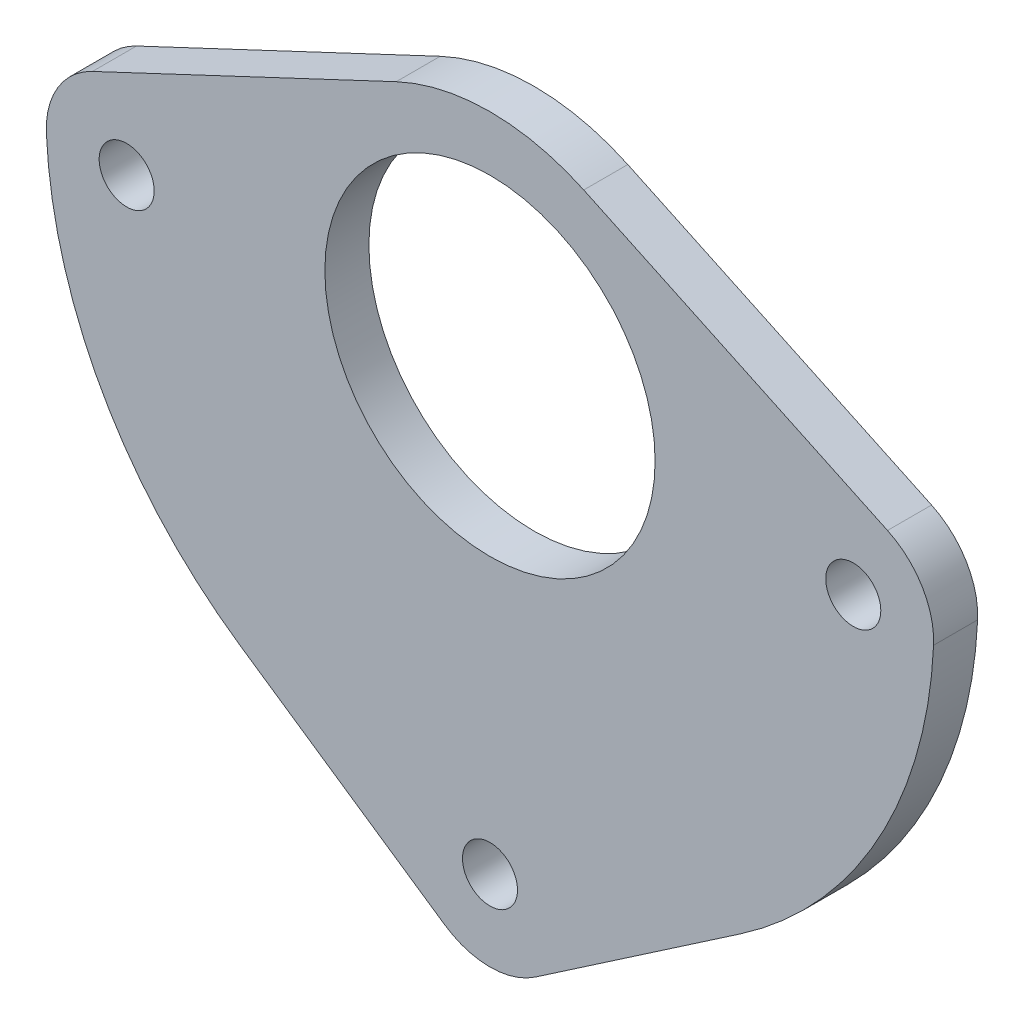
ISO-10303-21;
HEADER;
FILE_DESCRIPTION(('STEP AP214'),'2;1');
FILE_NAME('part.step','',(''),(''),'','','');
FILE_SCHEMA(('AUTOMOTIVE_DESIGN { 1 0 10303 214 1 1 1 1 }'));
ENDSEC;
DATA;
#1=APPLICATION_CONTEXT('core data for automotive mechanical design processes');
#2=APPLICATION_PROTOCOL_DEFINITION('international standard','automotive_design',2000,#1);
#3=PRODUCT_CONTEXT('',#1,'mechanical');
#4=PRODUCT('Part','Part','',(#3));
#5=PRODUCT_RELATED_PRODUCT_CATEGORY('part','',(#4));
#6=PRODUCT_DEFINITION_FORMATION('','',#4);
#7=PRODUCT_DEFINITION_CONTEXT('part definition',#1,'design');
#8=PRODUCT_DEFINITION('design','',#6,#7);
#9=PRODUCT_DEFINITION_SHAPE('','',#8);
#10=(LENGTH_UNIT() NAMED_UNIT(*) SI_UNIT(.MILLI.,.METRE.));
#11=(NAMED_UNIT(*) PLANE_ANGLE_UNIT() SI_UNIT($,.RADIAN.));
#12=(NAMED_UNIT(*) SI_UNIT($,.STERADIAN.) SOLID_ANGLE_UNIT());
#13=UNCERTAINTY_MEASURE_WITH_UNIT(LENGTH_MEASURE(1.E-05),#10,'distance_accuracy_value','');
#14=(GEOMETRIC_REPRESENTATION_CONTEXT(3) GLOBAL_UNCERTAINTY_ASSIGNED_CONTEXT((#13)) GLOBAL_UNIT_ASSIGNED_CONTEXT((#10,
#11,#12)) REPRESENTATION_CONTEXT('',''));
#15=CARTESIAN_POINT('',(0.,0.,0.));
#16=DIRECTION('',(0.,0.,1.));
#17=DIRECTION('',(1.,0.,0.));
#18=AXIS2_PLACEMENT_3D('',#15,#16,#17);
#19=CARTESIAN_POINT('',(137.79852098193,-51.7025,2.));
#20=DIRECTION('',(0.,0.,-1.));
#21=DIRECTION('',(-1.,0.,0.));
#22=AXIS2_PLACEMENT_3D('',#19,#20,#21);
#23=PLANE('',#22);
#24=CARTESIAN_POINT('',(137.79852098193,-51.7025,2.));
#25=DIRECTION('',(0.,0.,1.));
#26=DIRECTION('',(-1.,0.,0.));
#27=AXIS2_PLACEMENT_3D('',#24,#25,#26);
#28=CIRCLE('',#27,7.30249999999997);
#29=CARTESIAN_POINT('',(145.093488746815,-52.0340894438584,2.));
#30=VERTEX_POINT('',#29);
#31=CARTESIAN_POINT('',(140.908646061078,-45.0954107587341,2.));
#32=VERTEX_POINT('',#31);
#33=EDGE_CURVE('E161',#30,#32,#28,.T.);
#34=ORIENTED_EDGE('',*,*,#33,.T.);
#35=DIRECTION('',(-0.904770864945693,0.425898675679349,0.));
#36=VECTOR('',#35,1.);
#37=CARTESIAN_POINT('',(113.316494495517,-32.1070827010862,2.));
#38=LINE('',#37,#36);
#39=CARTESIAN_POINT('',(113.316494495517,-32.1070827010862,2.));
#40=VERTEX_POINT('',#39);
#41=EDGE_CURVE('E99',#32,#40,#38,.T.);
#42=ORIENTED_EDGE('',*,*,#41,.T.);
#43=CARTESIAN_POINT('',(104.79852098193,-50.2025,2.));
#44=DIRECTION('',(0.,0.,1.));
#45=DIRECTION('',(-1.,0.,0.));
#46=AXIS2_PLACEMENT_3D('',#43,#44,#45);
#47=CIRCLE('',#46,20.);
#48=CARTESIAN_POINT('',(96.2805474683429,-32.1070827010862,2.));
#49=VERTEX_POINT('',#48);
#50=EDGE_CURVE('E182',#40,#49,#47,.T.);
#51=ORIENTED_EDGE('',*,*,#50,.T.);
#52=DIRECTION('',(-0.904770864945693,-0.425898675679349,0.));
#53=VECTOR('',#52,1.);
#54=CARTESIAN_POINT('',(96.2805474683429,-32.1070827010862,2.));
#55=LINE('',#54,#53);
#56=CARTESIAN_POINT('',(68.6883959027814,-45.0954107587341,2.));
#57=VERTEX_POINT('',#56);
#58=EDGE_CURVE('E201',#49,#57,#55,.T.);
#59=ORIENTED_EDGE('',*,*,#58,.T.);
#60=CARTESIAN_POINT('',(71.7985209819299,-51.7025,2.));
#61=DIRECTION('',(0.,0.,1.));
#62=DIRECTION('',(1.,0.,0.));
#63=AXIS2_PLACEMENT_3D('',#60,#61,#62);
#64=CIRCLE('',#63,7.30249999999993);
#65=CARTESIAN_POINT('',(64.5035532170442,-52.0340894438585,2.));
#66=VERTEX_POINT('',#65);
#67=EDGE_CURVE('E198',#57,#66,#64,.T.);
#68=ORIENTED_EDGE('',*,*,#67,.T.);
#69=CARTESIAN_POINT('',(104.79852098193,-50.2025,2.));
#70=DIRECTION('',(0.,0.,1.));
#71=DIRECTION('',(1.,0.,0.));
#72=AXIS2_PLACEMENT_3D('',#69,#70,#71);
#73=CIRCLE('',#72,40.3365733183177);
#74=CARTESIAN_POINT('',(82.0652922016273,-83.5227559456924,2.));
#75=VERTEX_POINT('',#74);
#76=EDGE_CURVE('E200',#66,#75,#73,.T.);
#77=ORIENTED_EDGE('',*,*,#76,.T.);
#78=DIRECTION('',(0.826055691016293,-0.563588498232172,0.));
#79=VECTOR('',#78,1.);
#80=CARTESIAN_POINT('',(100.682915973589,-96.224900288264,2.));
#81=LINE('',#80,#79);
#82=CARTESIAN_POINT('',(100.682915973589,-96.224900288264,2.));
#83=VERTEX_POINT('',#82);
#84=EDGE_CURVE('E124',#75,#83,#81,.T.);
#85=ORIENTED_EDGE('',*,*,#84,.T.);
#86=CARTESIAN_POINT('',(104.79852098193,-90.1926286046177,2.));
#87=DIRECTION('',(0.,0.,1.));
#88=DIRECTION('',(1.,0.,0.));
#89=AXIS2_PLACEMENT_3D('',#86,#87,#88);
#90=CIRCLE('',#89,7.3024999999999);
#91=CARTESIAN_POINT('',(108.91412599027,-96.224900288264,2.));
#92=VERTEX_POINT('',#91);
#93=EDGE_CURVE('E118',#83,#92,#90,.T.);
#94=ORIENTED_EDGE('',*,*,#93,.T.);
#95=DIRECTION('',(0.826055691016293,0.563588498232172,0.));
#96=VECTOR('',#95,1.);
#97=CARTESIAN_POINT('',(108.91412599027,-96.224900288264,2.));
#98=LINE('',#97,#96);
#99=CARTESIAN_POINT('',(127.531749762232,-83.5227559456924,2.));
#100=VERTEX_POINT('',#99);
#101=EDGE_CURVE('E122',#92,#100,#98,.T.);
#102=ORIENTED_EDGE('',*,*,#101,.T.);
#103=CARTESIAN_POINT('',(104.79852098193,-50.2025,2.));
#104=DIRECTION('',(0.,0.,1.));
#105=DIRECTION('',(-1.,0.,0.));
#106=AXIS2_PLACEMENT_3D('',#103,#104,#105);
#107=CIRCLE('',#106,40.3365733183177);
#108=EDGE_CURVE('E50',#100,#30,#107,.T.);
#109=ORIENTED_EDGE('',*,*,#108,.T.);
#110=EDGE_LOOP('',(#34,#42,#51,#59,#68,#77,#85,#94,#102,#109));
#111=FACE_BOUND('',#110,.T.);
#112=CARTESIAN_POINT('',(71.7985209819299,-51.7025,2.));
#113=DIRECTION('',(0.,0.,1.));
#114=DIRECTION('',(1.,0.,0.));
#115=AXIS2_PLACEMENT_3D('',#112,#113,#114);
#116=CIRCLE('',#115,2.50000000000001);
#117=CARTESIAN_POINT('',(74.2985209819299,-51.7025,2.));
#118=VERTEX_POINT('',#117);
#119=EDGE_CURVE('E146',#118,#118,#116,.T.);
#120=ORIENTED_EDGE('',*,*,#119,.F.);
#121=EDGE_LOOP('',(#120));
#122=FACE_BOUND('',#121,.T.);
#123=CARTESIAN_POINT('',(104.79852098193,-90.1926286046176,2.));
#124=DIRECTION('',(0.,0.,1.));
#125=DIRECTION('',(1.,0.,0.));
#126=AXIS2_PLACEMENT_3D('',#123,#124,#125);
#127=CIRCLE('',#126,2.5);
#128=CARTESIAN_POINT('',(107.29852098193,-90.1926286046176,2.));
#129=VERTEX_POINT('',#128);
#130=EDGE_CURVE('E212',#129,#129,#127,.T.);
#131=ORIENTED_EDGE('',*,*,#130,.F.);
#132=EDGE_LOOP('',(#131));
#133=FACE_BOUND('',#132,.T.);
#134=CARTESIAN_POINT('',(137.79852098193,-51.7025,2.));
#135=DIRECTION('',(0.,0.,1.));
#136=DIRECTION('',(1.,0.,0.));
#137=AXIS2_PLACEMENT_3D('',#134,#135,#136);
#138=CIRCLE('',#137,2.5);
#139=CARTESIAN_POINT('',(140.29852098193,-51.7025,2.));
#140=VERTEX_POINT('',#139);
#141=EDGE_CURVE('E218',#140,#140,#138,.T.);
#142=ORIENTED_EDGE('',*,*,#141,.F.);
#143=EDGE_LOOP('',(#142));
#144=FACE_BOUND('',#143,.T.);
#145=CARTESIAN_POINT('',(104.79852098193,-50.2025,2.));
#146=DIRECTION('',(0.,0.,1.));
#147=DIRECTION('',(1.,0.,0.));
#148=AXIS2_PLACEMENT_3D('',#145,#146,#147);
#149=CIRCLE('',#148,15.);
#150=CARTESIAN_POINT('',(119.79852098193,-50.2025,2.));
#151=VERTEX_POINT('',#150);
#152=EDGE_CURVE('E224',#151,#151,#149,.T.);
#153=ORIENTED_EDGE('',*,*,#152,.F.);
#154=EDGE_LOOP('',(#153));
#155=FACE_BOUND('',#154,.T.);
#156=ADVANCED_FACE('F33',(#111,#122,#133,#144,#155),#23,.F.);
#157=CARTESIAN_POINT('',(137.79852098193,-51.7025,-2.));
#158=DIRECTION('',(0.,0.,-1.));
#159=DIRECTION('',(-1.,0.,0.));
#160=AXIS2_PLACEMENT_3D('',#157,#158,#159);
#161=PLANE('',#160);
#162=CARTESIAN_POINT('',(137.79852098193,-51.7025,-2.));
#163=DIRECTION('',(0.,0.,1.));
#164=DIRECTION('',(1.,0.,0.));
#165=AXIS2_PLACEMENT_3D('',#162,#163,#164);
#166=CIRCLE('',#165,2.5);
#167=CARTESIAN_POINT('',(140.29852098193,-51.7025,-2.));
#168=VERTEX_POINT('',#167);
#169=EDGE_CURVE('E221',#168,#168,#166,.T.);
#170=ORIENTED_EDGE('',*,*,#169,.T.);
#171=EDGE_LOOP('',(#170));
#172=FACE_BOUND('',#171,.T.);
#173=CARTESIAN_POINT('',(71.7985209819299,-51.7025,-2.));
#174=DIRECTION('',(0.,0.,1.));
#175=DIRECTION('',(1.,0.,0.));
#176=AXIS2_PLACEMENT_3D('',#173,#174,#175);
#177=CIRCLE('',#176,2.50000000000001);
#178=CARTESIAN_POINT('',(74.2985209819299,-51.7025,-2.));
#179=VERTEX_POINT('',#178);
#180=EDGE_CURVE('E209',#179,#179,#177,.T.);
#181=ORIENTED_EDGE('',*,*,#180,.T.);
#182=EDGE_LOOP('',(#181));
#183=FACE_BOUND('',#182,.T.);
#184=CARTESIAN_POINT('',(137.79852098193,-51.7025,-2.));
#185=DIRECTION('',(0.,0.,1.));
#186=DIRECTION('',(-1.,0.,0.));
#187=AXIS2_PLACEMENT_3D('',#184,#185,#186);
#188=CIRCLE('',#187,7.30249999999997);
#189=CARTESIAN_POINT('',(145.093488746815,-52.0340894438584,-2.));
#190=VERTEX_POINT('',#189);
#191=CARTESIAN_POINT('',(140.908646061078,-45.0954107587341,-2.));
#192=VERTEX_POINT('',#191);
#193=EDGE_CURVE('E142',#190,#192,#188,.T.);
#194=ORIENTED_EDGE('',*,*,#193,.F.);
#195=CARTESIAN_POINT('',(104.79852098193,-50.2025,-2.));
#196=DIRECTION('',(0.,0.,1.));
#197=DIRECTION('',(-1.,0.,0.));
#198=AXIS2_PLACEMENT_3D('',#195,#196,#197);
#199=CIRCLE('',#198,40.3365733183177);
#200=CARTESIAN_POINT('',(127.531749762232,-83.5227559456924,-2.));
#201=VERTEX_POINT('',#200);
#202=EDGE_CURVE('E91',#201,#190,#199,.T.);
#203=ORIENTED_EDGE('',*,*,#202,.F.);
#204=DIRECTION('',(0.826055691016293,0.563588498232172,0.));
#205=VECTOR('',#204,1.);
#206=CARTESIAN_POINT('',(108.91412599027,-96.224900288264,-2.));
#207=LINE('',#206,#205);
#208=CARTESIAN_POINT('',(108.91412599027,-96.224900288264,-2.));
#209=VERTEX_POINT('',#208);
#210=EDGE_CURVE('E85',#209,#201,#207,.T.);
#211=ORIENTED_EDGE('',*,*,#210,.F.);
#212=CARTESIAN_POINT('',(104.79852098193,-90.1926286046177,-2.));
#213=DIRECTION('',(0.,0.,1.));
#214=DIRECTION('',(1.,0.,0.));
#215=AXIS2_PLACEMENT_3D('',#212,#213,#214);
#216=CIRCLE('',#215,7.3024999999999);
#217=CARTESIAN_POINT('',(100.682915973589,-96.224900288264,-2.));
#218=VERTEX_POINT('',#217);
#219=EDGE_CURVE('E132',#218,#209,#216,.T.);
#220=ORIENTED_EDGE('',*,*,#219,.F.);
#221=DIRECTION('',(0.826055691016293,-0.563588498232172,0.));
#222=VECTOR('',#221,1.);
#223=CARTESIAN_POINT('',(100.682915973589,-96.224900288264,-2.));
#224=LINE('',#223,#222);
#225=CARTESIAN_POINT('',(82.0652922016273,-83.5227559456924,-2.));
#226=VERTEX_POINT('',#225);
#227=EDGE_CURVE('E156',#226,#218,#224,.T.);
#228=ORIENTED_EDGE('',*,*,#227,.F.);
#229=CARTESIAN_POINT('',(104.79852098193,-50.2025,-2.));
#230=DIRECTION('',(0.,0.,1.));
#231=DIRECTION('',(1.,0.,0.));
#232=AXIS2_PLACEMENT_3D('',#229,#230,#231);
#233=CIRCLE('',#232,40.3365733183177);
#234=CARTESIAN_POINT('',(64.5035532170442,-52.0340894438585,-2.));
#235=VERTEX_POINT('',#234);
#236=EDGE_CURVE('E154',#235,#226,#233,.T.);
#237=ORIENTED_EDGE('',*,*,#236,.F.);
#238=CARTESIAN_POINT('',(71.7985209819299,-51.7025,-2.));
#239=DIRECTION('',(0.,0.,1.));
#240=DIRECTION('',(1.,0.,0.));
#241=AXIS2_PLACEMENT_3D('',#238,#239,#240);
#242=CIRCLE('',#241,7.30249999999993);
#243=CARTESIAN_POINT('',(68.6883959027814,-45.0954107587341,-2.));
#244=VERTEX_POINT('',#243);
#245=EDGE_CURVE('E152',#244,#235,#242,.T.);
#246=ORIENTED_EDGE('',*,*,#245,.F.);
#247=DIRECTION('',(-0.904770864945693,-0.425898675679349,0.));
#248=VECTOR('',#247,1.);
#249=CARTESIAN_POINT('',(96.2805474683429,-32.1070827010862,-2.));
#250=LINE('',#249,#248);
#251=CARTESIAN_POINT('',(96.2805474683429,-32.1070827010862,-2.));
#252=VERTEX_POINT('',#251);
#253=EDGE_CURVE('E150',#252,#244,#250,.T.);
#254=ORIENTED_EDGE('',*,*,#253,.F.);
#255=CARTESIAN_POINT('',(104.79852098193,-50.2025,-2.));
#256=DIRECTION('',(0.,0.,1.));
#257=DIRECTION('',(-1.,0.,0.));
#258=AXIS2_PLACEMENT_3D('',#255,#256,#257);
#259=CIRCLE('',#258,20.);
#260=CARTESIAN_POINT('',(113.316494495517,-32.1070827010862,-2.));
#261=VERTEX_POINT('',#260);
#262=EDGE_CURVE('E148',#261,#252,#259,.T.);
#263=ORIENTED_EDGE('',*,*,#262,.F.);
#264=DIRECTION('',(-0.904770864945693,0.425898675679349,0.));
#265=VECTOR('',#264,1.);
#266=CARTESIAN_POINT('',(113.316494495517,-32.1070827010862,-2.));
#267=LINE('',#266,#265);
#268=EDGE_CURVE('E145',#192,#261,#267,.T.);
#269=ORIENTED_EDGE('',*,*,#268,.F.);
#270=EDGE_LOOP('',(#194,#203,#211,#220,#228,#237,#246,#254,#263,#269));
#271=FACE_BOUND('',#270,.T.);
#272=CARTESIAN_POINT('',(104.79852098193,-90.1926286046176,-2.));
#273=DIRECTION('',(0.,0.,1.));
#274=DIRECTION('',(1.,0.,0.));
#275=AXIS2_PLACEMENT_3D('',#272,#273,#274);
#276=CIRCLE('',#275,2.5);
#277=CARTESIAN_POINT('',(107.29852098193,-90.1926286046176,-2.));
#278=VERTEX_POINT('',#277);
#279=EDGE_CURVE('E215',#278,#278,#276,.T.);
#280=ORIENTED_EDGE('',*,*,#279,.T.);
#281=EDGE_LOOP('',(#280));
#282=FACE_BOUND('',#281,.T.);
#283=CARTESIAN_POINT('',(104.79852098193,-50.2025,-2.));
#284=DIRECTION('',(0.,0.,1.));
#285=DIRECTION('',(1.,0.,0.));
#286=AXIS2_PLACEMENT_3D('',#283,#284,#285);
#287=CIRCLE('',#286,15.);
#288=CARTESIAN_POINT('',(119.79852098193,-50.2025,-2.));
#289=VERTEX_POINT('',#288);
#290=EDGE_CURVE('E227',#289,#289,#287,.T.);
#291=ORIENTED_EDGE('',*,*,#290,.T.);
#292=EDGE_LOOP('',(#291));
#293=FACE_BOUND('',#292,.T.);
#294=ADVANCED_FACE('F186',(#172,#183,#271,#282,#293),#161,.T.);
#295=CARTESIAN_POINT('',(137.79852098193,-51.7025,2.));
#296=DIRECTION('',(0.,0.,-1.));
#297=DIRECTION('',(-1.,0.,0.));
#298=AXIS2_PLACEMENT_3D('',#295,#296,#297);
#299=CYLINDRICAL_SURFACE('',#298,7.30249999999997);
#300=ORIENTED_EDGE('',*,*,#193,.T.);
#301=DIRECTION('',(0.,0.,-1.));
#302=VECTOR('',#301,1.);
#303=CARTESIAN_POINT('',(140.908646061078,-45.0954107587341,2.));
#304=LINE('',#303,#302);
#305=EDGE_CURVE('E11',#32,#192,#304,.T.);
#306=ORIENTED_EDGE('',*,*,#305,.F.);
#307=ORIENTED_EDGE('',*,*,#33,.F.);
#308=DIRECTION('',(0.,0.,-1.));
#309=VECTOR('',#308,1.);
#310=CARTESIAN_POINT('',(145.093488746815,-52.0340894438584,2.));
#311=LINE('',#310,#309);
#312=EDGE_CURVE('E138',#30,#190,#311,.T.);
#313=ORIENTED_EDGE('',*,*,#312,.T.);
#314=EDGE_LOOP('',(#300,#306,#307,#313));
#315=FACE_BOUND('',#314,.T.);
#316=ADVANCED_FACE('F35',(#315),#299,.T.);
#317=CARTESIAN_POINT('',(113.316494495517,-32.1070827010862,2.));
#318=DIRECTION('',(-0.425898675679349,-0.904770864945693,0.));
#319=DIRECTION('',(0.904770864945693,-0.425898675679349,0.));
#320=AXIS2_PLACEMENT_3D('',#317,#318,#319);
#321=PLANE('',#320);
#322=ORIENTED_EDGE('',*,*,#268,.T.);
#323=DIRECTION('',(0.,0.,-1.));
#324=VECTOR('',#323,1.);
#325=CARTESIAN_POINT('',(113.316494495517,-32.1070827010862,2.));
#326=LINE('',#325,#324);
#327=EDGE_CURVE('E42',#40,#261,#326,.T.);
#328=ORIENTED_EDGE('',*,*,#327,.F.);
#329=ORIENTED_EDGE('',*,*,#41,.F.);
#330=ORIENTED_EDGE('',*,*,#305,.T.);
#331=EDGE_LOOP('',(#322,#328,#329,#330));
#332=FACE_BOUND('',#331,.T.);
#333=ADVANCED_FACE('F267',(#332),#321,.F.);
#334=CARTESIAN_POINT('',(104.79852098193,-50.2025,2.));
#335=DIRECTION('',(0.,0.,-1.));
#336=DIRECTION('',(-1.,0.,0.));
#337=AXIS2_PLACEMENT_3D('',#334,#335,#336);
#338=CYLINDRICAL_SURFACE('',#337,20.);
#339=ORIENTED_EDGE('',*,*,#262,.T.);
#340=DIRECTION('',(0.,0.,-1.));
#341=VECTOR('',#340,1.);
#342=CARTESIAN_POINT('',(96.2805474683429,-32.1070827010862,2.));
#343=LINE('',#342,#341);
#344=EDGE_CURVE('E174',#49,#252,#343,.T.);
#345=ORIENTED_EDGE('',*,*,#344,.F.);
#346=ORIENTED_EDGE('',*,*,#50,.F.);
#347=ORIENTED_EDGE('',*,*,#327,.T.);
#348=EDGE_LOOP('',(#339,#345,#346,#347));
#349=FACE_BOUND('',#348,.T.);
#350=ADVANCED_FACE('F180',(#349),#338,.T.);
#351=CARTESIAN_POINT('',(96.2805474683429,-32.1070827010862,2.));
#352=DIRECTION('',(0.425898675679349,-0.904770864945693,0.));
#353=DIRECTION('',(0.904770864945693,0.425898675679349,0.));
#354=AXIS2_PLACEMENT_3D('',#351,#352,#353);
#355=PLANE('',#354);
#356=ORIENTED_EDGE('',*,*,#253,.T.);
#357=DIRECTION('',(0.,0.,-1.));
#358=VECTOR('',#357,1.);
#359=CARTESIAN_POINT('',(68.6883959027814,-45.0954107587341,2.));
#360=LINE('',#359,#358);
#361=EDGE_CURVE('E171',#57,#244,#360,.T.);
#362=ORIENTED_EDGE('',*,*,#361,.F.);
#363=ORIENTED_EDGE('',*,*,#58,.F.);
#364=ORIENTED_EDGE('',*,*,#344,.T.);
#365=EDGE_LOOP('',(#356,#362,#363,#364));
#366=FACE_BOUND('',#365,.T.);
#367=ADVANCED_FACE('F192',(#366),#355,.F.);
#368=CARTESIAN_POINT('',(71.7985209819299,-51.7025,2.));
#369=DIRECTION('',(0.,0.,-1.));
#370=DIRECTION('',(-1.,0.,0.));
#371=AXIS2_PLACEMENT_3D('',#368,#369,#370);
#372=CYLINDRICAL_SURFACE('',#371,7.30249999999993);
#373=ORIENTED_EDGE('',*,*,#245,.T.);
#374=DIRECTION('',(0.,0.,-1.));
#375=VECTOR('',#374,1.);
#376=CARTESIAN_POINT('',(64.5035532170442,-52.0340894438585,2.));
#377=LINE('',#376,#375);
#378=EDGE_CURVE('E168',#66,#235,#377,.T.);
#379=ORIENTED_EDGE('',*,*,#378,.F.);
#380=ORIENTED_EDGE('',*,*,#67,.F.);
#381=ORIENTED_EDGE('',*,*,#361,.T.);
#382=EDGE_LOOP('',(#373,#379,#380,#381));
#383=FACE_BOUND('',#382,.T.);
#384=ADVANCED_FACE('F196',(#383),#372,.T.);
#385=CARTESIAN_POINT('',(104.79852098193,-50.2025,2.));
#386=DIRECTION('',(0.,0.,-1.));
#387=DIRECTION('',(-1.,0.,0.));
#388=AXIS2_PLACEMENT_3D('',#385,#386,#387);
#389=CYLINDRICAL_SURFACE('',#388,40.3365733183177);
#390=ORIENTED_EDGE('',*,*,#236,.T.);
#391=DIRECTION('',(0.,0.,-1.));
#392=VECTOR('',#391,1.);
#393=CARTESIAN_POINT('',(82.0652922016273,-83.5227559456924,2.));
#394=LINE('',#393,#392);
#395=EDGE_CURVE('E165',#75,#226,#394,.T.);
#396=ORIENTED_EDGE('',*,*,#395,.F.);
#397=ORIENTED_EDGE('',*,*,#76,.F.);
#398=ORIENTED_EDGE('',*,*,#378,.T.);
#399=EDGE_LOOP('',(#390,#396,#397,#398));
#400=FACE_BOUND('',#399,.T.);
#401=ADVANCED_FACE('F257',(#400),#389,.T.);
#402=CARTESIAN_POINT('',(100.682915973589,-96.224900288264,2.));
#403=DIRECTION('',(0.563588498232172,0.826055691016293,0.));
#404=DIRECTION('',(-0.826055691016293,0.563588498232172,0.));
#405=AXIS2_PLACEMENT_3D('',#402,#403,#404);
#406=PLANE('',#405);
#407=ORIENTED_EDGE('',*,*,#227,.T.);
#408=DIRECTION('',(0.,0.,-1.));
#409=VECTOR('',#408,1.);
#410=CARTESIAN_POINT('',(100.682915973589,-96.224900288264,2.));
#411=LINE('',#410,#409);
#412=EDGE_CURVE('E133',#83,#218,#411,.T.);
#413=ORIENTED_EDGE('',*,*,#412,.F.);
#414=ORIENTED_EDGE('',*,*,#84,.F.);
#415=ORIENTED_EDGE('',*,*,#395,.T.);
#416=EDGE_LOOP('',(#407,#413,#414,#415));
#417=FACE_BOUND('',#416,.T.);
#418=ADVANCED_FACE('F254',(#417),#406,.F.);
#419=CARTESIAN_POINT('',(104.79852098193,-90.1926286046177,2.));
#420=DIRECTION('',(0.,0.,-1.));
#421=DIRECTION('',(-1.,0.,0.));
#422=AXIS2_PLACEMENT_3D('',#419,#420,#421);
#423=CYLINDRICAL_SURFACE('',#422,7.3024999999999);
#424=ORIENTED_EDGE('',*,*,#219,.T.);
#425=DIRECTION('',(0.,0.,-1.));
#426=VECTOR('',#425,1.);
#427=CARTESIAN_POINT('',(108.91412599027,-96.224900288264,2.));
#428=LINE('',#427,#426);
#429=EDGE_CURVE('E129',#92,#209,#428,.T.);
#430=ORIENTED_EDGE('',*,*,#429,.F.);
#431=ORIENTED_EDGE('',*,*,#93,.F.);
#432=ORIENTED_EDGE('',*,*,#412,.T.);
#433=EDGE_LOOP('',(#424,#430,#431,#432));
#434=FACE_BOUND('',#433,.T.);
#435=ADVANCED_FACE('F130',(#434),#423,.T.);
#436=CARTESIAN_POINT('',(108.91412599027,-96.224900288264,2.));
#437=DIRECTION('',(-0.563588498232172,0.826055691016293,0.));
#438=DIRECTION('',(-0.826055691016293,-0.563588498232172,0.));
#439=AXIS2_PLACEMENT_3D('',#436,#437,#438);
#440=PLANE('',#439);
#441=ORIENTED_EDGE('',*,*,#210,.T.);
#442=DIRECTION('',(0.,0.,-1.));
#443=VECTOR('',#442,1.);
#444=CARTESIAN_POINT('',(127.531749762232,-83.5227559456924,2.));
#445=LINE('',#444,#443);
#446=EDGE_CURVE('E134',#100,#201,#445,.T.);
#447=ORIENTED_EDGE('',*,*,#446,.F.);
#448=ORIENTED_EDGE('',*,*,#101,.F.);
#449=ORIENTED_EDGE('',*,*,#429,.T.);
#450=EDGE_LOOP('',(#441,#447,#448,#449));
#451=FACE_BOUND('',#450,.T.);
#452=ADVANCED_FACE('F136',(#451),#440,.F.);
#453=CARTESIAN_POINT('',(104.79852098193,-50.2025,2.));
#454=DIRECTION('',(0.,0.,-1.));
#455=DIRECTION('',(-1.,0.,0.));
#456=AXIS2_PLACEMENT_3D('',#453,#454,#455);
#457=CYLINDRICAL_SURFACE('',#456,40.3365733183177);
#458=ORIENTED_EDGE('',*,*,#202,.T.);
#459=ORIENTED_EDGE('',*,*,#312,.F.);
#460=ORIENTED_EDGE('',*,*,#108,.F.);
#461=ORIENTED_EDGE('',*,*,#446,.T.);
#462=EDGE_LOOP('',(#458,#459,#460,#461));
#463=FACE_BOUND('',#462,.T.);
#464=ADVANCED_FACE('F247',(#463),#457,.T.);
#465=CARTESIAN_POINT('',(71.7985209819299,-51.7025,2.));
#466=DIRECTION('',(0.,0.,-1.));
#467=DIRECTION('',(-1.,0.,0.));
#468=AXIS2_PLACEMENT_3D('',#465,#466,#467);
#469=CYLINDRICAL_SURFACE('',#468,2.50000000000001);
#470=ORIENTED_EDGE('',*,*,#119,.T.);
#471=EDGE_LOOP('',(#470));
#472=FACE_BOUND('',#471,.T.);
#473=ORIENTED_EDGE('',*,*,#180,.F.);
#474=EDGE_LOOP('',(#473));
#475=FACE_BOUND('',#474,.T.);
#476=ADVANCED_FACE('F244',(#472,#475),#469,.F.);
#477=CARTESIAN_POINT('',(104.79852098193,-90.1926286046176,2.));
#478=DIRECTION('',(0.,0.,-1.));
#479=DIRECTION('',(-1.,0.,0.));
#480=AXIS2_PLACEMENT_3D('',#477,#478,#479);
#481=CYLINDRICAL_SURFACE('',#480,2.5);
#482=ORIENTED_EDGE('',*,*,#130,.T.);
#483=EDGE_LOOP('',(#482));
#484=FACE_BOUND('',#483,.T.);
#485=ORIENTED_EDGE('',*,*,#279,.F.);
#486=EDGE_LOOP('',(#485));
#487=FACE_BOUND('',#486,.T.);
#488=ADVANCED_FACE('F343',(#484,#487),#481,.F.);
#489=CARTESIAN_POINT('',(137.79852098193,-51.7025,2.));
#490=DIRECTION('',(0.,0.,-1.));
#491=DIRECTION('',(-1.,0.,0.));
#492=AXIS2_PLACEMENT_3D('',#489,#490,#491);
#493=CYLINDRICAL_SURFACE('',#492,2.5);
#494=ORIENTED_EDGE('',*,*,#141,.T.);
#495=EDGE_LOOP('',(#494));
#496=FACE_BOUND('',#495,.T.);
#497=ORIENTED_EDGE('',*,*,#169,.F.);
#498=EDGE_LOOP('',(#497));
#499=FACE_BOUND('',#498,.T.);
#500=ADVANCED_FACE('F351',(#496,#499),#493,.F.);
#501=CARTESIAN_POINT('',(104.79852098193,-50.2025,2.));
#502=DIRECTION('',(0.,0.,-1.));
#503=DIRECTION('',(-1.,0.,0.));
#504=AXIS2_PLACEMENT_3D('',#501,#502,#503);
#505=CYLINDRICAL_SURFACE('',#504,15.);
#506=ORIENTED_EDGE('',*,*,#152,.T.);
#507=EDGE_LOOP('',(#506));
#508=FACE_BOUND('',#507,.T.);
#509=ORIENTED_EDGE('',*,*,#290,.F.);
#510=EDGE_LOOP('',(#509));
#511=FACE_BOUND('',#510,.T.);
#512=ADVANCED_FACE('F233',(#508,#511),#505,.F.);
#513=CLOSED_SHELL('',(#156,#294,#316,#333,#350,#367,#384,#401,#418,#435,#452,#464,#476,#488,
#500,#512));
#514=MANIFOLD_SOLID_BREP('B2',#513);
#515=ADVANCED_BREP_SHAPE_REPRESENTATION('',(#18,#514),#14);
#516=SHAPE_DEFINITION_REPRESENTATION(#9,#515);
ENDSEC;
END-ISO-10303-21;
